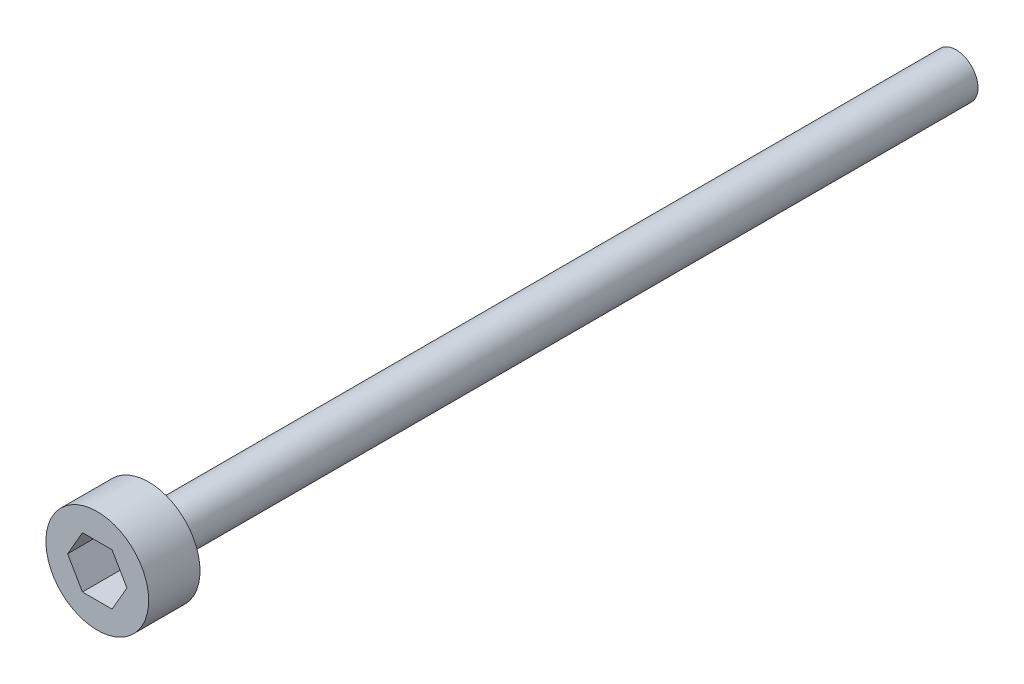
ISO-10303-21;
HEADER;
FILE_DESCRIPTION(('STEP AP214'),'2;1');
FILE_NAME('part.step','',(''),(''),'','','');
FILE_SCHEMA(('AUTOMOTIVE_DESIGN { 1 0 10303 214 1 1 1 1 }'));
ENDSEC;
DATA;
#1=APPLICATION_CONTEXT('core data for automotive mechanical design processes');
#2=APPLICATION_PROTOCOL_DEFINITION('international standard','automotive_design',2000,#1);
#3=PRODUCT_CONTEXT('',#1,'mechanical');
#4=PRODUCT('Part','Part','',(#3));
#5=PRODUCT_RELATED_PRODUCT_CATEGORY('part','',(#4));
#6=PRODUCT_DEFINITION_FORMATION('','',#4);
#7=PRODUCT_DEFINITION_CONTEXT('part definition',#1,'design');
#8=PRODUCT_DEFINITION('design','',#6,#7);
#9=PRODUCT_DEFINITION_SHAPE('','',#8);
#10=(LENGTH_UNIT() NAMED_UNIT(*) SI_UNIT(.MILLI.,.METRE.));
#11=(NAMED_UNIT(*) PLANE_ANGLE_UNIT() SI_UNIT($,.RADIAN.));
#12=(NAMED_UNIT(*) SI_UNIT($,.STERADIAN.) SOLID_ANGLE_UNIT());
#13=UNCERTAINTY_MEASURE_WITH_UNIT(LENGTH_MEASURE(1.E-05),#10,'distance_accuracy_value','');
#14=(GEOMETRIC_REPRESENTATION_CONTEXT(3) GLOBAL_UNCERTAINTY_ASSIGNED_CONTEXT((#13)) GLOBAL_UNIT_ASSIGNED_CONTEXT((#10,
#11,#12)) REPRESENTATION_CONTEXT('',''));
#15=CARTESIAN_POINT('',(0.,0.,0.));
#16=DIRECTION('',(0.,0.,1.));
#17=DIRECTION('',(1.,0.,0.));
#18=AXIS2_PLACEMENT_3D('',#15,#16,#17);
#19=CARTESIAN_POINT('',(0.,0.,3.5));
#20=DIRECTION('',(0.,0.,-1.));
#21=DIRECTION('',(-1.,0.,0.));
#22=AXIS2_PLACEMENT_3D('',#19,#20,#21);
#23=CYLINDRICAL_SURFACE('',#22,3.5);
#24=CARTESIAN_POINT('',(0.,0.,3.5));
#25=DIRECTION('',(0.,0.,1.));
#26=DIRECTION('',(1.,0.,0.));
#27=AXIS2_PLACEMENT_3D('',#24,#25,#26);
#28=CIRCLE('',#27,3.5);
#29=CARTESIAN_POINT('',(3.5,0.,3.5));
#30=VERTEX_POINT('',#29);
#31=EDGE_CURVE('E11',#30,#30,#28,.T.);
#32=ORIENTED_EDGE('',*,*,#31,.F.);
#33=EDGE_LOOP('',(#32));
#34=FACE_BOUND('',#33,.T.);
#35=CARTESIAN_POINT('',(0.,0.,0.));
#36=DIRECTION('',(0.,0.,1.));
#37=DIRECTION('',(1.,0.,0.));
#38=AXIS2_PLACEMENT_3D('',#35,#36,#37);
#39=CIRCLE('',#38,3.5);
#40=CARTESIAN_POINT('',(3.5,0.,0.));
#41=VERTEX_POINT('',#40);
#42=EDGE_CURVE('E38',#41,#41,#39,.T.);
#43=ORIENTED_EDGE('',*,*,#42,.T.);
#44=EDGE_LOOP('',(#43));
#45=FACE_BOUND('',#44,.T.);
#46=ADVANCED_FACE('F35',(#34,#45),#23,.T.);
#47=CARTESIAN_POINT('',(0.,0.,3.5));
#48=DIRECTION('',(0.,0.,1.));
#49=DIRECTION('',(1.,0.,0.));
#50=AXIS2_PLACEMENT_3D('',#47,#48,#49);
#51=PLANE('',#50);
#52=DIRECTION('',(-0.499999999999528,-0.866025403784711,0.));
#53=VECTOR('',#52,1.);
#54=CARTESIAN_POINT('',(-2.02072594216261,2.1557411053031E-12,3.5));
#55=LINE('',#54,#53);
#56=CARTESIAN_POINT('',(-1.01036297108294,1.75000000000058,3.5));
#57=VERTEX_POINT('',#56);
#58=CARTESIAN_POINT('',(-2.02072594216261,2.15561075933568E-12,3.5));
#59=VERTEX_POINT('',#58);
#60=EDGE_CURVE('E49',#57,#59,#55,.T.);
#61=ORIENTED_EDGE('',*,*,#60,.F.);
#62=DIRECTION('',(-1.,-7.11024037944377E-13,0.));
#63=VECTOR('',#62,1.);
#64=CARTESIAN_POINT('',(-1.01036297108294,1.75000000000058,3.5));
#65=LINE('',#64,#63);
#66=CARTESIAN_POINT('',(1.01036297108301,1.75000000000202,3.5));
#67=VERTEX_POINT('',#66);
#68=EDGE_CURVE('E133',#67,#57,#65,.T.);
#69=ORIENTED_EDGE('',*,*,#68,.F.);
#70=DIRECTION('',(-0.50000000000043,0.86602540378419,0.));
#71=VECTOR('',#70,1.);
#72=CARTESIAN_POINT('',(1.01036297108301,1.75000000000202,3.5));
#73=LINE('',#72,#71);
#74=CARTESIAN_POINT('',(2.02072594216593,2.15574110530311E-12,3.5));
#75=VERTEX_POINT('',#74);
#76=EDGE_CURVE('E131',#75,#67,#73,.T.);
#77=ORIENTED_EDGE('',*,*,#76,.F.);
#78=DIRECTION('',(0.499999999999527,0.866025403784711,0.));
#79=VECTOR('',#78,1.);
#80=CARTESIAN_POINT('',(2.02072594216593,2.15574110530311E-12,3.5));
#81=LINE('',#80,#79);
#82=CARTESIAN_POINT('',(1.01036297108301,-1.75000000000192,3.5));
#83=VERTEX_POINT('',#82);
#84=EDGE_CURVE('E97',#83,#75,#81,.T.);
#85=ORIENTED_EDGE('',*,*,#84,.F.);
#86=DIRECTION('',(1.,7.11024037946673E-13,0.));
#87=VECTOR('',#86,1.);
#88=CARTESIAN_POINT('',(1.01036297108301,-1.75000000000192,3.5));
#89=LINE('',#88,#87);
#90=CARTESIAN_POINT('',(-1.01036297107642,-1.75000000000336,3.5));
#91=VERTEX_POINT('',#90);
#92=EDGE_CURVE('E127',#91,#83,#89,.T.);
#93=ORIENTED_EDGE('',*,*,#92,.F.);
#94=DIRECTION('',(0.500000000000431,-0.86602540378419,0.));
#95=VECTOR('',#94,1.);
#96=CARTESIAN_POINT('',(-1.01036297107642,-1.75000000000336,3.5));
#97=LINE('',#96,#95);
#98=EDGE_CURVE('E123',#59,#91,#97,.T.);
#99=ORIENTED_EDGE('',*,*,#98,.F.);
#100=EDGE_LOOP('',(#61,#69,#77,#85,#93,#99));
#101=FACE_BOUND('',#100,.T.);
#102=ORIENTED_EDGE('',*,*,#31,.T.);
#103=EDGE_LOOP('',(#102));
#104=FACE_BOUND('',#103,.T.);
#105=ADVANCED_FACE('F146',(#101,#104),#51,.T.);
#106=CARTESIAN_POINT('',(0.,0.,0.));
#107=DIRECTION('',(0.,0.,1.));
#108=DIRECTION('',(1.,0.,0.));
#109=AXIS2_PLACEMENT_3D('',#106,#107,#108);
#110=PLANE('',#109);
#111=CARTESIAN_POINT('',(0.,0.,0.));
#112=DIRECTION('',(0.,0.,1.));
#113=DIRECTION('',(1.,0.,0.));
#114=AXIS2_PLACEMENT_3D('',#111,#112,#113);
#115=CIRCLE('',#114,1.5);
#116=CARTESIAN_POINT('',(1.5,0.,0.));
#117=VERTEX_POINT('',#116);
#118=EDGE_CURVE('E153',#117,#117,#115,.T.);
#119=ORIENTED_EDGE('',*,*,#118,.T.);
#120=EDGE_LOOP('',(#119));
#121=FACE_BOUND('',#120,.T.);
#122=ORIENTED_EDGE('',*,*,#42,.F.);
#123=EDGE_LOOP('',(#122));
#124=FACE_BOUND('',#123,.T.);
#125=ADVANCED_FACE('F174',(#121,#124),#110,.F.);
#126=CARTESIAN_POINT('',(-2.02072594216261,2.1557411053031E-12,0.7));
#127=DIRECTION('',(-0.866025403784711,0.499999999999528,0.));
#128=DIRECTION('',(-0.499999999999528,-0.866025403784711,0.));
#129=AXIS2_PLACEMENT_3D('',#126,#127,#128);
#130=PLANE('',#129);
#131=ORIENTED_EDGE('',*,*,#60,.T.);
#132=DIRECTION('',(0.,0.,1.));
#133=VECTOR('',#132,1.);
#134=CARTESIAN_POINT('',(-2.02072594216261,2.1557411053031E-12,0.7));
#135=LINE('',#134,#133);
#136=CARTESIAN_POINT('',(-2.02072594216261,2.1557411053031E-12,0.7));
#137=VERTEX_POINT('',#136);
#138=EDGE_CURVE('E79',#137,#59,#135,.T.);
#139=ORIENTED_EDGE('',*,*,#138,.F.);
#140=DIRECTION('',(-0.499999999999528,-0.866025403784711,0.));
#141=VECTOR('',#140,1.);
#142=CARTESIAN_POINT('',(-2.02072594216261,2.1557411053031E-12,0.7));
#143=LINE('',#142,#141);
#144=CARTESIAN_POINT('',(-1.01036297108294,1.75000000000058,0.7));
#145=VERTEX_POINT('',#144);
#146=EDGE_CURVE('E135',#145,#137,#143,.T.);
#147=ORIENTED_EDGE('',*,*,#146,.F.);
#148=DIRECTION('',(0.,0.,1.));
#149=VECTOR('',#148,1.);
#150=CARTESIAN_POINT('',(-1.01036297108294,1.75000000000058,0.7));
#151=LINE('',#150,#149);
#152=EDGE_CURVE('E57',#145,#57,#151,.T.);
#153=ORIENTED_EDGE('',*,*,#152,.T.);
#154=EDGE_LOOP('',(#131,#139,#147,#153));
#155=FACE_BOUND('',#154,.T.);
#156=ADVANCED_FACE('F182',(#155),#130,.F.);
#157=CARTESIAN_POINT('',(-1.01036297108294,1.75000000000058,0.7));
#158=DIRECTION('',(-7.11024037944377E-13,1.,0.));
#159=DIRECTION('',(-1.,-7.11024037944377E-13,0.));
#160=AXIS2_PLACEMENT_3D('',#157,#158,#159);
#161=PLANE('',#160);
#162=ORIENTED_EDGE('',*,*,#68,.T.);
#163=ORIENTED_EDGE('',*,*,#152,.F.);
#164=DIRECTION('',(-1.,-7.11024037944377E-13,0.));
#165=VECTOR('',#164,1.);
#166=CARTESIAN_POINT('',(-1.01036297108294,1.75000000000058,0.7));
#167=LINE('',#166,#165);
#168=CARTESIAN_POINT('',(1.01036297108301,1.75000000000202,0.7));
#169=VERTEX_POINT('',#168);
#170=EDGE_CURVE('E109',#169,#145,#167,.T.);
#171=ORIENTED_EDGE('',*,*,#170,.F.);
#172=DIRECTION('',(0.,0.,1.));
#173=VECTOR('',#172,1.);
#174=CARTESIAN_POINT('',(1.01036297108301,1.75000000000202,0.7));
#175=LINE('',#174,#173);
#176=EDGE_CURVE('E101',#169,#67,#175,.T.);
#177=ORIENTED_EDGE('',*,*,#176,.T.);
#178=EDGE_LOOP('',(#162,#163,#171,#177));
#179=FACE_BOUND('',#178,.T.);
#180=ADVANCED_FACE('F187',(#179),#161,.F.);
#181=CARTESIAN_POINT('',(1.01036297108301,1.75000000000202,0.7));
#182=DIRECTION('',(0.86602540378419,0.50000000000043,0.));
#183=DIRECTION('',(-0.50000000000043,0.86602540378419,0.));
#184=AXIS2_PLACEMENT_3D('',#181,#182,#183);
#185=PLANE('',#184);
#186=ORIENTED_EDGE('',*,*,#76,.T.);
#187=ORIENTED_EDGE('',*,*,#176,.F.);
#188=DIRECTION('',(-0.50000000000043,0.86602540378419,0.));
#189=VECTOR('',#188,1.);
#190=CARTESIAN_POINT('',(1.01036297108301,1.75000000000202,0.7));
#191=LINE('',#190,#189);
#192=CARTESIAN_POINT('',(2.02072594216593,2.15574110530311E-12,0.7));
#193=VERTEX_POINT('',#192);
#194=EDGE_CURVE('E105',#193,#169,#191,.T.);
#195=ORIENTED_EDGE('',*,*,#194,.F.);
#196=DIRECTION('',(0.,0.,1.));
#197=VECTOR('',#196,1.);
#198=CARTESIAN_POINT('',(2.02072594216593,2.15574110530311E-12,0.7));
#199=LINE('',#198,#197);
#200=EDGE_CURVE('E90',#193,#75,#199,.T.);
#201=ORIENTED_EDGE('',*,*,#200,.T.);
#202=EDGE_LOOP('',(#186,#187,#195,#201));
#203=FACE_BOUND('',#202,.T.);
#204=ADVANCED_FACE('F106',(#203),#185,.F.);
#205=CARTESIAN_POINT('',(2.02072594216593,2.15574110530311E-12,0.7));
#206=DIRECTION('',(0.866025403784712,-0.499999999999527,0.));
#207=DIRECTION('',(0.499999999999527,0.866025403784712,0.));
#208=AXIS2_PLACEMENT_3D('',#205,#206,#207);
#209=PLANE('',#208);
#210=ORIENTED_EDGE('',*,*,#84,.T.);
#211=ORIENTED_EDGE('',*,*,#200,.F.);
#212=DIRECTION('',(0.499999999999527,0.866025403784711,0.));
#213=VECTOR('',#212,1.);
#214=CARTESIAN_POINT('',(2.02072594216593,2.15574110530311E-12,0.7));
#215=LINE('',#214,#213);
#216=CARTESIAN_POINT('',(1.01036297108301,-1.75000000000192,0.7));
#217=VERTEX_POINT('',#216);
#218=EDGE_CURVE('E94',#217,#193,#215,.T.);
#219=ORIENTED_EDGE('',*,*,#218,.F.);
#220=DIRECTION('',(0.,0.,1.));
#221=VECTOR('',#220,1.);
#222=CARTESIAN_POINT('',(1.01036297108301,-1.75000000000192,0.7));
#223=LINE('',#222,#221);
#224=EDGE_CURVE('E102',#217,#83,#223,.T.);
#225=ORIENTED_EDGE('',*,*,#224,.T.);
#226=EDGE_LOOP('',(#210,#211,#219,#225));
#227=FACE_BOUND('',#226,.T.);
#228=ADVANCED_FACE('F92',(#227),#209,.F.);
#229=CARTESIAN_POINT('',(1.01036297108301,-1.75000000000192,0.7));
#230=DIRECTION('',(7.11024037946673E-13,-1.,0.));
#231=DIRECTION('',(1.,7.11024037946673E-13,0.));
#232=AXIS2_PLACEMENT_3D('',#229,#230,#231);
#233=PLANE('',#232);
#234=ORIENTED_EDGE('',*,*,#92,.T.);
#235=ORIENTED_EDGE('',*,*,#224,.F.);
#236=DIRECTION('',(1.,7.11024037946673E-13,0.));
#237=VECTOR('',#236,1.);
#238=CARTESIAN_POINT('',(1.01036297108301,-1.75000000000192,0.7));
#239=LINE('',#238,#237);
#240=CARTESIAN_POINT('',(-1.01036297107642,-1.75000000000336,0.7));
#241=VERTEX_POINT('',#240);
#242=EDGE_CURVE('E115',#241,#217,#239,.T.);
#243=ORIENTED_EDGE('',*,*,#242,.F.);
#244=DIRECTION('',(0.,0.,1.));
#245=VECTOR('',#244,1.);
#246=CARTESIAN_POINT('',(-1.01036297107642,-1.75000000000336,0.7));
#247=LINE('',#246,#245);
#248=EDGE_CURVE('E139',#241,#91,#247,.T.);
#249=ORIENTED_EDGE('',*,*,#248,.T.);
#250=EDGE_LOOP('',(#234,#235,#243,#249));
#251=FACE_BOUND('',#250,.T.);
#252=ADVANCED_FACE('F150',(#251),#233,.F.);
#253=CARTESIAN_POINT('',(-1.01036297107642,-1.75000000000336,0.7));
#254=DIRECTION('',(-0.86602540378419,-0.500000000000431,0.));
#255=DIRECTION('',(0.500000000000431,-0.86602540378419,0.));
#256=AXIS2_PLACEMENT_3D('',#253,#254,#255);
#257=PLANE('',#256);
#258=ORIENTED_EDGE('',*,*,#98,.T.);
#259=ORIENTED_EDGE('',*,*,#248,.F.);
#260=DIRECTION('',(0.500000000000431,-0.86602540378419,0.));
#261=VECTOR('',#260,1.);
#262=CARTESIAN_POINT('',(-1.01036297107642,-1.75000000000336,0.7));
#263=LINE('',#262,#261);
#264=EDGE_CURVE('E117',#137,#241,#263,.T.);
#265=ORIENTED_EDGE('',*,*,#264,.F.);
#266=ORIENTED_EDGE('',*,*,#138,.T.);
#267=EDGE_LOOP('',(#258,#259,#265,#266));
#268=FACE_BOUND('',#267,.T.);
#269=ADVANCED_FACE('F143',(#268),#257,.F.);
#270=CARTESIAN_POINT('',(-1.01036297108294,1.75000000000058,0.7));
#271=DIRECTION('',(0.,0.,-1.));
#272=DIRECTION('',(-1.,0.,0.));
#273=AXIS2_PLACEMENT_3D('',#270,#271,#272);
#274=PLANE('',#273);
#275=ORIENTED_EDGE('',*,*,#146,.T.);
#276=ORIENTED_EDGE('',*,*,#264,.T.);
#277=ORIENTED_EDGE('',*,*,#242,.T.);
#278=ORIENTED_EDGE('',*,*,#218,.T.);
#279=ORIENTED_EDGE('',*,*,#194,.T.);
#280=ORIENTED_EDGE('',*,*,#170,.T.);
#281=EDGE_LOOP('',(#275,#276,#277,#278,#279,#280));
#282=FACE_BOUND('',#281,.T.);
#283=ADVANCED_FACE('F112',(#282),#274,.F.);
#284=CARTESIAN_POINT('',(0.,0.,-55.));
#285=DIRECTION('',(0.,0.,1.));
#286=DIRECTION('',(1.,0.,0.));
#287=AXIS2_PLACEMENT_3D('',#284,#285,#286);
#288=CYLINDRICAL_SURFACE('',#287,1.5);
#289=CARTESIAN_POINT('',(0.,0.,-55.));
#290=DIRECTION('',(0.,0.,1.));
#291=DIRECTION('',(1.,0.,0.));
#292=AXIS2_PLACEMENT_3D('',#289,#290,#291);
#293=CIRCLE('',#292,1.5);
#294=CARTESIAN_POINT('',(1.5,0.,-55.));
#295=VERTEX_POINT('',#294);
#296=EDGE_CURVE('E124',#295,#295,#293,.T.);
#297=ORIENTED_EDGE('',*,*,#296,.T.);
#298=EDGE_LOOP('',(#297));
#299=FACE_BOUND('',#298,.T.);
#300=ORIENTED_EDGE('',*,*,#118,.F.);
#301=EDGE_LOOP('',(#300));
#302=FACE_BOUND('',#301,.T.);
#303=ADVANCED_FACE('F159',(#299,#302),#288,.T.);
#304=CARTESIAN_POINT('',(0.,0.,-55.));
#305=DIRECTION('',(0.,0.,1.));
#306=DIRECTION('',(1.,0.,0.));
#307=AXIS2_PLACEMENT_3D('',#304,#305,#306);
#308=PLANE('',#307);
#309=ORIENTED_EDGE('',*,*,#296,.F.);
#310=EDGE_LOOP('',(#309));
#311=FACE_BOUND('',#310,.T.);
#312=ADVANCED_FACE('F162',(#311),#308,.F.);
#313=CLOSED_SHELL('',(#46,#105,#125,#156,#180,#204,#228,#252,#269,#283,#303,#312));
#314=MANIFOLD_SOLID_BREP('B2',#313);
#315=ADVANCED_BREP_SHAPE_REPRESENTATION('',(#18,#314),#14);
#316=SHAPE_DEFINITION_REPRESENTATION(#9,#315);
ENDSEC;
END-ISO-10303-21;
